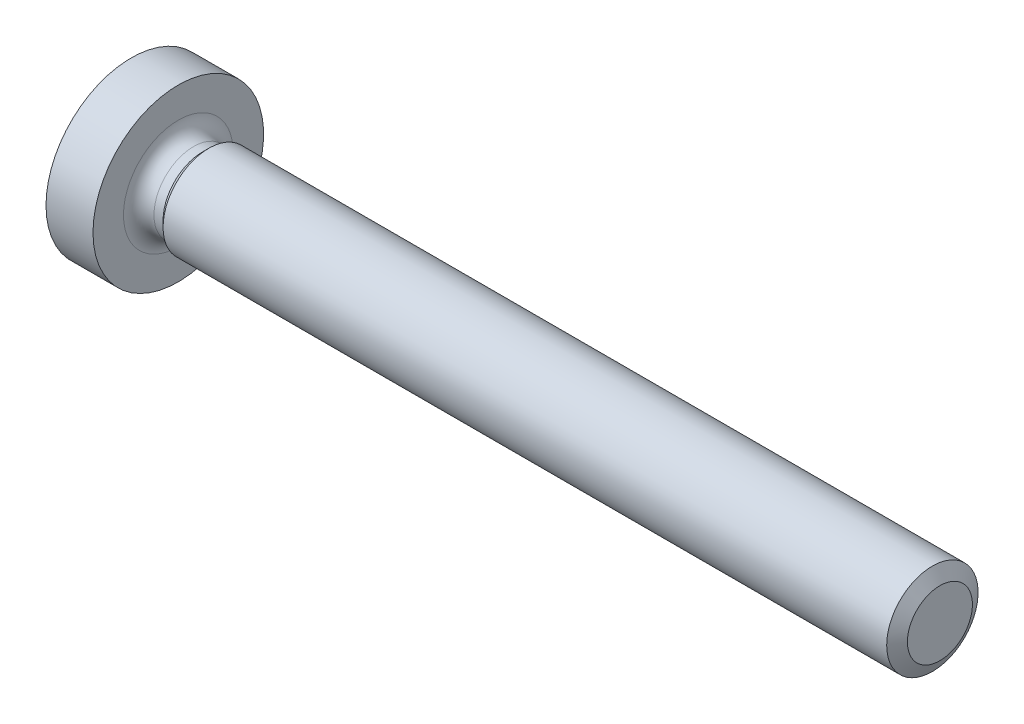
ISO-10303-21;
HEADER;
FILE_DESCRIPTION(('STEP AP214'),'2;1');
FILE_NAME('part.step','',(''),(''),'','','');
FILE_SCHEMA(('AUTOMOTIVE_DESIGN { 1 0 10303 214 1 1 1 1 }'));
ENDSEC;
DATA;
#1=APPLICATION_CONTEXT('core data for automotive mechanical design processes');
#2=APPLICATION_PROTOCOL_DEFINITION('international standard','automotive_design',2000,#1);
#3=PRODUCT_CONTEXT('',#1,'mechanical');
#4=PRODUCT('Part','Part','',(#3));
#5=PRODUCT_RELATED_PRODUCT_CATEGORY('part','',(#4));
#6=PRODUCT_DEFINITION_FORMATION('','',#4);
#7=PRODUCT_DEFINITION_CONTEXT('part definition',#1,'design');
#8=PRODUCT_DEFINITION('design','',#6,#7);
#9=PRODUCT_DEFINITION_SHAPE('','',#8);
#10=(LENGTH_UNIT() NAMED_UNIT(*) SI_UNIT(.MILLI.,.METRE.));
#11=(NAMED_UNIT(*) PLANE_ANGLE_UNIT() SI_UNIT($,.RADIAN.));
#12=(NAMED_UNIT(*) SI_UNIT($,.STERADIAN.) SOLID_ANGLE_UNIT());
#13=UNCERTAINTY_MEASURE_WITH_UNIT(LENGTH_MEASURE(1.E-05),#10,'distance_accuracy_value','');
#14=(GEOMETRIC_REPRESENTATION_CONTEXT(3) GLOBAL_UNCERTAINTY_ASSIGNED_CONTEXT((#13)) GLOBAL_UNIT_ASSIGNED_CONTEXT((#10,
#11,#12)) REPRESENTATION_CONTEXT('',''));
#15=CARTESIAN_POINT('',(0.,0.,0.));
#16=DIRECTION('',(0.,0.,1.));
#17=DIRECTION('',(1.,0.,0.));
#18=AXIS2_PLACEMENT_3D('',#15,#16,#17);
#19=CARTESIAN_POINT('',(1.8,0.,0.));
#20=DIRECTION('',(0.137568371274688,0.,-0.990492273177751));
#21=DIRECTION('',(-0.990492273177752,0.,-0.137568371274688));
#22=AXIS2_PLACEMENT_3D('',#19,#20,#21);
#23=PLANE('',#22);
#24=DIRECTION('',(-0.763885421064628,-0.636571184220523,-0.106095197370087));
#25=VECTOR('',#24,1.);
#26=CARTESIAN_POINT('',(1.8,0.,0.));
#27=LINE('',#26,#25);
#28=CARTESIAN_POINT('',(1.8,0.,0.));
#29=VERTEX_POINT('',#28);
#30=CARTESIAN_POINT('',(0.188839901093437,-1.34263341575547,-0.223772235959245));
#31=VERTEX_POINT('',#30);
#32=EDGE_CURVE('E156',#29,#31,#27,.T.);
#33=ORIENTED_EDGE('',*,*,#32,.F.);
#34=DIRECTION('',(-0.981250680241291,-0.136284816700179,-0.136284816700179));
#35=VECTOR('',#34,1.);
#36=CARTESIAN_POINT('',(1.8,0.,0.));
#37=LINE('',#36,#35);
#38=CARTESIAN_POINT('',(0.0123443765883179,-0.248285503251622,-0.248285503251623));
#39=VERTEX_POINT('',#38);
#40=EDGE_CURVE('E117',#29,#39,#37,.T.);
#41=ORIENTED_EDGE('',*,*,#40,.T.);
#42=CARTESIAN_POINT('',(4.93943981831946,0.,0.436033308099924));
#43=DIRECTION('',(0.137568371274688,0.,-0.990492273177751));
#44=DIRECTION('',(-0.990492273177752,0.,-0.137568371274688));
#45=AXIS2_PLACEMENT_3D('',#42,#43,#44);
#46=CIRCLE('',#45,4.98058304002877);
#47=EDGE_CURVE('E130',#31,#39,#46,.T.);
#48=ORIENTED_EDGE('',*,*,#47,.F.);
#49=EDGE_LOOP('',(#33,#41,#48));
#50=FACE_BOUND('',#49,.T.);
#51=ADVANCED_FACE('F37',(#50),#23,.F.);
#52=CARTESIAN_POINT('',(1.8,0.,0.));
#53=DIRECTION('',(0.137568371274688,0.,0.990492273177752));
#54=DIRECTION('',(0.990492273177752,0.,-0.137568371274688));
#55=AXIS2_PLACEMENT_3D('',#52,#53,#54);
#56=PLANE('',#55);
#57=CARTESIAN_POINT('',(4.93943981831946,0.,-0.436033308099924));
#58=DIRECTION('',(0.137568371274688,0.,0.990492273177752));
#59=DIRECTION('',(0.990492273177752,0.,-0.137568371274688));
#60=AXIS2_PLACEMENT_3D('',#57,#58,#59);
#61=CIRCLE('',#60,4.98058304002877);
#62=CARTESIAN_POINT('',(0.0123443765883179,-0.248285503251624,0.248285503251622));
#63=VERTEX_POINT('',#62);
#64=CARTESIAN_POINT('',(0.188839901093437,-1.34263341575547,0.223772235959245));
#65=VERTEX_POINT('',#64);
#66=EDGE_CURVE('E60',#63,#65,#61,.T.);
#67=ORIENTED_EDGE('',*,*,#66,.F.);
#68=DIRECTION('',(0.981250680241291,0.13628481670018,-0.136284816700179));
#69=VECTOR('',#68,1.);
#70=CARTESIAN_POINT('',(1.8,0.,0.));
#71=LINE('',#70,#69);
#72=EDGE_CURVE('E11',#63,#29,#71,.T.);
#73=ORIENTED_EDGE('',*,*,#72,.T.);
#74=DIRECTION('',(-0.763885421064628,-0.636571184220523,0.106095197370087));
#75=VECTOR('',#74,1.);
#76=CARTESIAN_POINT('',(1.8,0.,0.));
#77=LINE('',#76,#75);
#78=EDGE_CURVE('E157',#29,#65,#77,.T.);
#79=ORIENTED_EDGE('',*,*,#78,.T.);
#80=EDGE_LOOP('',(#67,#73,#79));
#81=FACE_BOUND('',#80,.T.);
#82=ADVANCED_FACE('F172',(#81),#56,.F.);
#83=CARTESIAN_POINT('',(-1.33175770411172,0.,0.));
#84=DIRECTION('',(-1.,0.,0.));
#85=DIRECTION('',(0.,0.,1.));
#86=AXIS2_PLACEMENT_3D('',#83,#84,#85);
#87=CYLINDRICAL_SURFACE('',#86,1.5);
#88=CARTESIAN_POINT('',(3.4,0.,0.));
#89=DIRECTION('',(-1.,0.,0.));
#90=DIRECTION('',(0.,0.,1.));
#91=AXIS2_PLACEMENT_3D('',#88,#89,#90);
#92=CIRCLE('',#91,1.5);
#93=CARTESIAN_POINT('',(3.4,0.,1.5));
#94=VERTEX_POINT('',#93);
#95=EDGE_CURVE('E193',#94,#94,#92,.T.);
#96=ORIENTED_EDGE('',*,*,#95,.F.);
#97=EDGE_LOOP('',(#96));
#98=FACE_BOUND('',#97,.T.);
#99=CARTESIAN_POINT('',(27.1527080028722,0.,0.));
#100=DIRECTION('',(-1.,0.,0.));
#101=DIRECTION('',(0.,0.,1.));
#102=AXIS2_PLACEMENT_3D('',#99,#100,#101);
#103=CIRCLE('',#102,1.5);
#104=CARTESIAN_POINT('',(27.1527080028722,0.,1.5));
#105=VERTEX_POINT('',#104);
#106=EDGE_CURVE('E190',#105,#105,#103,.T.);
#107=ORIENTED_EDGE('',*,*,#106,.T.);
#108=EDGE_LOOP('',(#107));
#109=FACE_BOUND('',#108,.T.);
#110=ADVANCED_FACE('F237',(#98,#109),#87,.T.);
#111=CARTESIAN_POINT('',(5.,0.,0.));
#112=DIRECTION('',(-1.,0.,0.));
#113=DIRECTION('',(0.,1.,0.));
#114=AXIS2_PLACEMENT_3D('',#111,#112,#113);
#115=SPHERICAL_SURFACE('',#114,5.);
#116=CARTESIAN_POINT('',(3.68852459016393,0.,-1.57377049180328));
#117=DIRECTION('',(0.64018439966448,0.,0.768221279597376));
#118=DIRECTION('',(0.768221279597376,0.,-0.64018439966448));
#119=AXIS2_PLACEMENT_3D('',#116,#117,#118);
#120=CIRCLE('',#119,4.56106113624062);
#121=CARTESIAN_POINT('',(0.188839901093437,0.22377223595924,1.34263341575547));
#122=VERTEX_POINT('',#121);
#123=CARTESIAN_POINT('',(0.188839901093437,-0.22377223595925,1.34263341575547));
#124=VERTEX_POINT('',#123);
#125=EDGE_CURVE('E123',#122,#124,#120,.T.);
#126=ORIENTED_EDGE('',*,*,#125,.T.);
#127=CARTESIAN_POINT('',(4.93943981831946,0.436033308099924,0.));
#128=DIRECTION('',(0.137568371274688,-0.990492273177751,0.));
#129=DIRECTION('',(0.990492273177752,0.137568371274688,0.));
#130=AXIS2_PLACEMENT_3D('',#127,#128,#129);
#131=CIRCLE('',#130,4.98058304002877);
#132=EDGE_CURVE('E139',#124,#63,#131,.T.);
#133=ORIENTED_EDGE('',*,*,#132,.T.);
#134=ORIENTED_EDGE('',*,*,#66,.T.);
#135=CARTESIAN_POINT('',(3.68852459016393,1.57377049180328,0.));
#136=DIRECTION('',(0.64018439966448,-0.768221279597376,0.));
#137=DIRECTION('',(0.768221279597376,0.64018439966448,0.));
#138=AXIS2_PLACEMENT_3D('',#135,#136,#137);
#139=CIRCLE('',#138,4.56106113624062);
#140=EDGE_CURVE('E169',#65,#31,#139,.T.);
#141=ORIENTED_EDGE('',*,*,#140,.T.);
#142=ORIENTED_EDGE('',*,*,#47,.T.);
#143=CARTESIAN_POINT('',(0.188839901093437,-0.22377223595924,-1.34263341575547));
#144=VERTEX_POINT('',#143);
#145=EDGE_CURVE('E119',#39,#144,#131,.T.);
#146=ORIENTED_EDGE('',*,*,#145,.T.);
#147=CARTESIAN_POINT('',(3.68852459016393,0.,1.57377049180328));
#148=DIRECTION('',(0.64018439966448,0.,-0.768221279597376));
#149=DIRECTION('',(-0.768221279597376,0.,-0.64018439966448));
#150=AXIS2_PLACEMENT_3D('',#147,#148,#149);
#151=CIRCLE('',#150,4.56106113624062);
#152=CARTESIAN_POINT('',(0.188839901093437,0.223772235959249,-1.34263341575547));
#153=VERTEX_POINT('',#152);
#154=EDGE_CURVE('E111',#144,#153,#151,.T.);
#155=ORIENTED_EDGE('',*,*,#154,.T.);
#156=CARTESIAN_POINT('',(4.93943981831946,-0.436033308099924,0.));
#157=DIRECTION('',(0.137568371274688,0.990492273177752,0.));
#158=DIRECTION('',(-0.990492273177752,0.137568371274688,0.));
#159=AXIS2_PLACEMENT_3D('',#156,#157,#158);
#160=CIRCLE('',#159,4.98058304002877);
#161=CARTESIAN_POINT('',(0.0123443765883179,0.248285503251624,-0.248285503251623));
#162=VERTEX_POINT('',#161);
#163=EDGE_CURVE('E102',#153,#162,#160,.T.);
#164=ORIENTED_EDGE('',*,*,#163,.T.);
#165=CARTESIAN_POINT('',(0.188839901093437,1.34263341575547,-0.223772235959245));
#166=VERTEX_POINT('',#165);
#167=EDGE_CURVE('E147',#162,#166,#46,.T.);
#168=ORIENTED_EDGE('',*,*,#167,.T.);
#169=CARTESIAN_POINT('',(3.68852459016393,-1.57377049180328,0.));
#170=DIRECTION('',(0.64018439966448,0.768221279597376,0.));
#171=DIRECTION('',(-0.768221279597376,0.64018439966448,0.));
#172=AXIS2_PLACEMENT_3D('',#169,#170,#171);
#173=CIRCLE('',#172,4.56106113624062);
#174=CARTESIAN_POINT('',(0.188839901093437,1.34263341575547,0.223772235959245));
#175=VERTEX_POINT('',#174);
#176=EDGE_CURVE('E160',#166,#175,#173,.T.);
#177=ORIENTED_EDGE('',*,*,#176,.T.);
#178=CARTESIAN_POINT('',(0.0123443765883179,0.248285503251622,0.248285503251622));
#179=VERTEX_POINT('',#178);
#180=EDGE_CURVE('E152',#175,#179,#61,.T.);
#181=ORIENTED_EDGE('',*,*,#180,.T.);
#182=EDGE_CURVE('E52',#179,#122,#160,.T.);
#183=ORIENTED_EDGE('',*,*,#182,.T.);
#184=EDGE_LOOP('',(#126,#133,#134,#141,#142,#146,#155,#164,#168,#177,#181,#183));
#185=FACE_BOUND('',#184,.T.);
#186=CARTESIAN_POINT('',(0.857536964558404,0.,0.));
#187=DIRECTION('',(-1.,0.,0.));
#188=DIRECTION('',(0.,0.,1.));
#189=AXIS2_PLACEMENT_3D('',#186,#187,#188);
#190=CIRCLE('',#189,2.8);
#191=CARTESIAN_POINT('',(0.857536964558404,0.,2.8));
#192=VERTEX_POINT('',#191);
#193=EDGE_CURVE('E173',#192,#192,#190,.T.);
#194=ORIENTED_EDGE('',*,*,#193,.T.);
#195=EDGE_LOOP('',(#194));
#196=FACE_BOUND('',#195,.T.);
#197=ADVANCED_FACE('F39',(#185,#196),#115,.T.);
#198=CARTESIAN_POINT('',(-1.33175770411172,0.,0.));
#199=DIRECTION('',(-1.,0.,0.));
#200=DIRECTION('',(0.,0.,1.));
#201=AXIS2_PLACEMENT_3D('',#198,#199,#200);
#202=CYLINDRICAL_SURFACE('',#201,2.8);
#203=ORIENTED_EDGE('',*,*,#193,.F.);
#204=EDGE_LOOP('',(#203));
#205=FACE_BOUND('',#204,.T.);
#206=CARTESIAN_POINT('',(2.4,0.,0.));
#207=DIRECTION('',(-1.,0.,0.));
#208=DIRECTION('',(0.,0.,1.));
#209=AXIS2_PLACEMENT_3D('',#206,#207,#208);
#210=CIRCLE('',#209,2.8);
#211=CARTESIAN_POINT('',(2.4,0.,2.8));
#212=VERTEX_POINT('',#211);
#213=EDGE_CURVE('E176',#212,#212,#210,.T.);
#214=ORIENTED_EDGE('',*,*,#213,.T.);
#215=EDGE_LOOP('',(#214));
#216=FACE_BOUND('',#215,.T.);
#217=ADVANCED_FACE('F210',(#205,#216),#202,.T.);
#218=CARTESIAN_POINT('',(2.4,1.8,0.));
#219=DIRECTION('',(-1.,0.,0.));
#220=DIRECTION('',(0.,0.,1.));
#221=AXIS2_PLACEMENT_3D('',#218,#219,#220);
#222=PLANE('',#221);
#223=ORIENTED_EDGE('',*,*,#213,.F.);
#224=EDGE_LOOP('',(#223));
#225=FACE_BOUND('',#224,.T.);
#226=CARTESIAN_POINT('',(2.4,0.,0.));
#227=DIRECTION('',(-1.,0.,0.));
#228=DIRECTION('',(0.,0.,1.));
#229=AXIS2_PLACEMENT_3D('',#226,#227,#228);
#230=CIRCLE('',#229,1.8);
#231=CARTESIAN_POINT('',(2.4,0.,1.8));
#232=VERTEX_POINT('',#231);
#233=EDGE_CURVE('E202',#232,#232,#230,.T.);
#234=ORIENTED_EDGE('',*,*,#233,.T.);
#235=EDGE_LOOP('',(#234));
#236=FACE_BOUND('',#235,.T.);
#237=ADVANCED_FACE('F212',(#225,#236),#222,.F.);
#238=CARTESIAN_POINT('',(2.901,0.,0.));
#239=DIRECTION('',(-1.,0.,0.));
#240=DIRECTION('',(0.,0.,1.));
#241=AXIS2_PLACEMENT_3D('',#238,#239,#240);
#242=TOROIDAL_SURFACE('',#241,1.8,0.501);
#243=ORIENTED_EDGE('',*,*,#233,.F.);
#244=EDGE_LOOP('',(#243));
#245=FACE_BOUND('',#244,.T.);
#246=CARTESIAN_POINT('',(2.901,0.,0.));
#247=DIRECTION('',(-1.,0.,0.));
#248=DIRECTION('',(0.,0.,1.));
#249=AXIS2_PLACEMENT_3D('',#246,#247,#248);
#250=CIRCLE('',#249,1.299);
#251=CARTESIAN_POINT('',(2.901,0.,1.299));
#252=VERTEX_POINT('',#251);
#253=EDGE_CURVE('E199',#252,#252,#250,.T.);
#254=ORIENTED_EDGE('',*,*,#253,.T.);
#255=EDGE_LOOP('',(#254));
#256=FACE_BOUND('',#255,.T.);
#257=ADVANCED_FACE('F215',(#245,#256),#242,.F.);
#258=CARTESIAN_POINT('',(-1.33175770411172,0.,0.));
#259=DIRECTION('',(-1.,0.,0.));
#260=DIRECTION('',(0.,0.,1.));
#261=AXIS2_PLACEMENT_3D('',#258,#259,#260);
#262=CYLINDRICAL_SURFACE('',#261,1.299);
#263=ORIENTED_EDGE('',*,*,#253,.F.);
#264=EDGE_LOOP('',(#263));
#265=FACE_BOUND('',#264,.T.);
#266=CARTESIAN_POINT('',(3.199,0.,0.));
#267=DIRECTION('',(-1.,0.,0.));
#268=DIRECTION('',(0.,0.,1.));
#269=AXIS2_PLACEMENT_3D('',#266,#267,#268);
#270=CIRCLE('',#269,1.299);
#271=CARTESIAN_POINT('',(3.199,0.,1.299));
#272=VERTEX_POINT('',#271);
#273=EDGE_CURVE('E196',#272,#272,#270,.T.);
#274=ORIENTED_EDGE('',*,*,#273,.T.);
#275=EDGE_LOOP('',(#274));
#276=FACE_BOUND('',#275,.T.);
#277=ADVANCED_FACE('F221',(#265,#276),#262,.T.);
#278=CARTESIAN_POINT('',(3.4,0.,0.));
#279=DIRECTION('',(1.,0.,0.));
#280=DIRECTION('',(0.,0.,-1.));
#281=AXIS2_PLACEMENT_3D('',#278,#279,#280);
#282=CONICAL_SURFACE('',#281,1.5,0.785398163397443);
#283=ORIENTED_EDGE('',*,*,#273,.F.);
#284=EDGE_LOOP('',(#283));
#285=FACE_BOUND('',#284,.T.);
#286=ORIENTED_EDGE('',*,*,#95,.T.);
#287=EDGE_LOOP('',(#286));
#288=FACE_BOUND('',#287,.T.);
#289=ADVANCED_FACE('F227',(#285,#288),#282,.T.);
#290=CARTESIAN_POINT('',(27.1527080028722,0.,0.));
#291=DIRECTION('',(-1.,0.,0.));
#292=DIRECTION('',(0.,0.,1.));
#293=AXIS2_PLACEMENT_3D('',#290,#291,#292);
#294=CONICAL_SURFACE('',#293,1.5,1.05188801855298);
#295=CARTESIAN_POINT('',(27.4,0.,0.));
#296=DIRECTION('',(-1.,0.,0.));
#297=DIRECTION('',(0.,0.,1.));
#298=AXIS2_PLACEMENT_3D('',#295,#296,#297);
#299=CIRCLE('',#298,1.067);
#300=CARTESIAN_POINT('',(27.4,0.,1.067));
#301=VERTEX_POINT('',#300);
#302=EDGE_CURVE('E161',#301,#301,#299,.T.);
#303=ORIENTED_EDGE('',*,*,#302,.T.);
#304=EDGE_LOOP('',(#303));
#305=FACE_BOUND('',#304,.T.);
#306=ORIENTED_EDGE('',*,*,#106,.F.);
#307=EDGE_LOOP('',(#306));
#308=FACE_BOUND('',#307,.T.);
#309=ADVANCED_FACE('F233',(#305,#308),#294,.T.);
#310=CARTESIAN_POINT('',(27.4,0.,0.));
#311=DIRECTION('',(-1.,0.,0.));
#312=DIRECTION('',(0.,0.,1.));
#313=AXIS2_PLACEMENT_3D('',#310,#311,#312);
#314=PLANE('',#313);
#315=ORIENTED_EDGE('',*,*,#302,.F.);
#316=EDGE_LOOP('',(#315));
#317=FACE_BOUND('',#316,.T.);
#318=ADVANCED_FACE('F244',(#317),#314,.F.);
#319=ORIENTED_EDGE('',*,*,#167,.F.);
#320=DIRECTION('',(0.981250680241291,-0.13628481670018,0.136284816700179));
#321=VECTOR('',#320,1.);
#322=CARTESIAN_POINT('',(1.8,0.,0.));
#323=LINE('',#322,#321);
#324=EDGE_CURVE('E100',#162,#29,#323,.T.);
#325=ORIENTED_EDGE('',*,*,#324,.T.);
#326=DIRECTION('',(-0.763885421064628,0.636571184220523,-0.106095197370087));
#327=VECTOR('',#326,1.);
#328=CARTESIAN_POINT('',(1.8,0.,0.));
#329=LINE('',#328,#327);
#330=EDGE_CURVE('E146',#29,#166,#329,.T.);
#331=ORIENTED_EDGE('',*,*,#330,.T.);
#332=EDGE_LOOP('',(#319,#325,#331));
#333=FACE_BOUND('',#332,.T.);
#334=ADVANCED_FACE('F144',(#333),#23,.F.);
#335=CARTESIAN_POINT('',(0.,1.5,-0.25));
#336=DIRECTION('',(0.64018439966448,0.768221279597376,0.));
#337=DIRECTION('',(-0.768221279597376,0.64018439966448,0.));
#338=AXIS2_PLACEMENT_3D('',#335,#336,#337);
#339=PLANE('',#338);
#340=ORIENTED_EDGE('',*,*,#330,.F.);
#341=DIRECTION('',(-0.763885421064628,0.636571184220523,0.106095197370087));
#342=VECTOR('',#341,1.);
#343=CARTESIAN_POINT('',(1.8,0.,0.));
#344=LINE('',#343,#342);
#345=EDGE_CURVE('E150',#29,#175,#344,.T.);
#346=ORIENTED_EDGE('',*,*,#345,.T.);
#347=ORIENTED_EDGE('',*,*,#176,.F.);
#348=EDGE_LOOP('',(#340,#346,#347));
#349=FACE_BOUND('',#348,.T.);
#350=ADVANCED_FACE('F159',(#349),#339,.F.);
#351=CARTESIAN_POINT('',(0.,-1.5,0.25));
#352=DIRECTION('',(0.64018439966448,-0.768221279597376,0.));
#353=DIRECTION('',(0.768221279597376,0.64018439966448,0.));
#354=AXIS2_PLACEMENT_3D('',#351,#352,#353);
#355=PLANE('',#354);
#356=ORIENTED_EDGE('',*,*,#78,.F.);
#357=ORIENTED_EDGE('',*,*,#32,.T.);
#358=ORIENTED_EDGE('',*,*,#140,.F.);
#359=EDGE_LOOP('',(#356,#357,#358));
#360=FACE_BOUND('',#359,.T.);
#361=ADVANCED_FACE('F168',(#360),#355,.F.);
#362=ORIENTED_EDGE('',*,*,#345,.F.);
#363=DIRECTION('',(-0.981250680241291,0.136284816700179,0.136284816700179));
#364=VECTOR('',#363,1.);
#365=CARTESIAN_POINT('',(1.8,0.,0.));
#366=LINE('',#365,#364);
#367=EDGE_CURVE('E45',#29,#179,#366,.T.);
#368=ORIENTED_EDGE('',*,*,#367,.T.);
#369=ORIENTED_EDGE('',*,*,#180,.F.);
#370=EDGE_LOOP('',(#362,#368,#369));
#371=FACE_BOUND('',#370,.T.);
#372=ADVANCED_FACE('F151',(#371),#56,.F.);
#373=CARTESIAN_POINT('',(1.8,0.,0.));
#374=DIRECTION('',(0.137568371274688,-0.990492273177751,0.));
#375=DIRECTION('',(-0.990492273177752,-0.137568371274688,0.));
#376=AXIS2_PLACEMENT_3D('',#373,#374,#375);
#377=PLANE('',#376);
#378=DIRECTION('',(-0.763885421064628,-0.106095197370089,0.636571184220523));
#379=VECTOR('',#378,1.);
#380=CARTESIAN_POINT('',(1.8,0.,0.));
#381=LINE('',#380,#379);
#382=EDGE_CURVE('E114',#29,#124,#381,.T.);
#383=ORIENTED_EDGE('',*,*,#382,.F.);
#384=ORIENTED_EDGE('',*,*,#72,.F.);
#385=ORIENTED_EDGE('',*,*,#132,.F.);
#386=EDGE_LOOP('',(#383,#384,#385));
#387=FACE_BOUND('',#386,.T.);
#388=ADVANCED_FACE('F138',(#387),#377,.F.);
#389=CARTESIAN_POINT('',(1.8,0.,0.));
#390=DIRECTION('',(0.137568371274688,0.990492273177752,0.));
#391=DIRECTION('',(0.990492273177752,-0.137568371274688,0.));
#392=AXIS2_PLACEMENT_3D('',#389,#390,#391);
#393=PLANE('',#392);
#394=ORIENTED_EDGE('',*,*,#367,.F.);
#395=DIRECTION('',(-0.763885421064628,0.106095197370085,0.636571184220523));
#396=VECTOR('',#395,1.);
#397=CARTESIAN_POINT('',(1.8,0.,0.));
#398=LINE('',#397,#396);
#399=EDGE_CURVE('E105',#29,#122,#398,.T.);
#400=ORIENTED_EDGE('',*,*,#399,.T.);
#401=ORIENTED_EDGE('',*,*,#182,.F.);
#402=EDGE_LOOP('',(#394,#400,#401));
#403=FACE_BOUND('',#402,.T.);
#404=ADVANCED_FACE('F126',(#403),#393,.F.);
#405=CARTESIAN_POINT('',(0.,-0.250000000000005,1.5));
#406=DIRECTION('',(0.64018439966448,0.,0.768221279597376));
#407=DIRECTION('',(-0.768221279597376,0.,0.64018439966448));
#408=AXIS2_PLACEMENT_3D('',#405,#406,#407);
#409=PLANE('',#408);
#410=ORIENTED_EDGE('',*,*,#399,.F.);
#411=ORIENTED_EDGE('',*,*,#382,.T.);
#412=ORIENTED_EDGE('',*,*,#125,.F.);
#413=EDGE_LOOP('',(#410,#411,#412));
#414=FACE_BOUND('',#413,.T.);
#415=ADVANCED_FACE('F134',(#414),#409,.F.);
#416=ORIENTED_EDGE('',*,*,#40,.F.);
#417=DIRECTION('',(-0.763885421064628,-0.106095197370085,-0.636571184220523));
#418=VECTOR('',#417,1.);
#419=CARTESIAN_POINT('',(1.8,0.,0.));
#420=LINE('',#419,#418);
#421=EDGE_CURVE('E108',#29,#144,#420,.T.);
#422=ORIENTED_EDGE('',*,*,#421,.T.);
#423=ORIENTED_EDGE('',*,*,#145,.F.);
#424=EDGE_LOOP('',(#416,#422,#423));
#425=FACE_BOUND('',#424,.T.);
#426=ADVANCED_FACE('F118',(#425),#377,.F.);
#427=CARTESIAN_POINT('',(0.,0.250000000000005,-1.5));
#428=DIRECTION('',(0.64018439966448,0.,-0.768221279597376));
#429=DIRECTION('',(0.768221279597376,0.,0.64018439966448));
#430=AXIS2_PLACEMENT_3D('',#427,#428,#429);
#431=PLANE('',#430);
#432=ORIENTED_EDGE('',*,*,#421,.F.);
#433=DIRECTION('',(-0.763885421064628,0.106095197370089,-0.636571184220523));
#434=VECTOR('',#433,1.);
#435=CARTESIAN_POINT('',(1.8,0.,0.));
#436=LINE('',#435,#434);
#437=EDGE_CURVE('E96',#29,#153,#436,.T.);
#438=ORIENTED_EDGE('',*,*,#437,.T.);
#439=ORIENTED_EDGE('',*,*,#154,.F.);
#440=EDGE_LOOP('',(#432,#438,#439));
#441=FACE_BOUND('',#440,.T.);
#442=ADVANCED_FACE('F110',(#441),#431,.F.);
#443=ORIENTED_EDGE('',*,*,#437,.F.);
#444=ORIENTED_EDGE('',*,*,#324,.F.);
#445=ORIENTED_EDGE('',*,*,#163,.F.);
#446=EDGE_LOOP('',(#443,#444,#445));
#447=FACE_BOUND('',#446,.T.);
#448=ADVANCED_FACE('F98',(#447),#393,.F.);
#449=CLOSED_SHELL('',(#51,#82,#110,#197,#217,#237,#257,#277,#289,#309,#318,#334,#350,#361,#372,
#388,#404,#415,#426,#442,#448));
#450=MANIFOLD_SOLID_BREP('B2',#449);
#451=ADVANCED_BREP_SHAPE_REPRESENTATION('',(#18,#450),#14);
#452=SHAPE_DEFINITION_REPRESENTATION(#9,#451);
ENDSEC;
END-ISO-10303-21;
